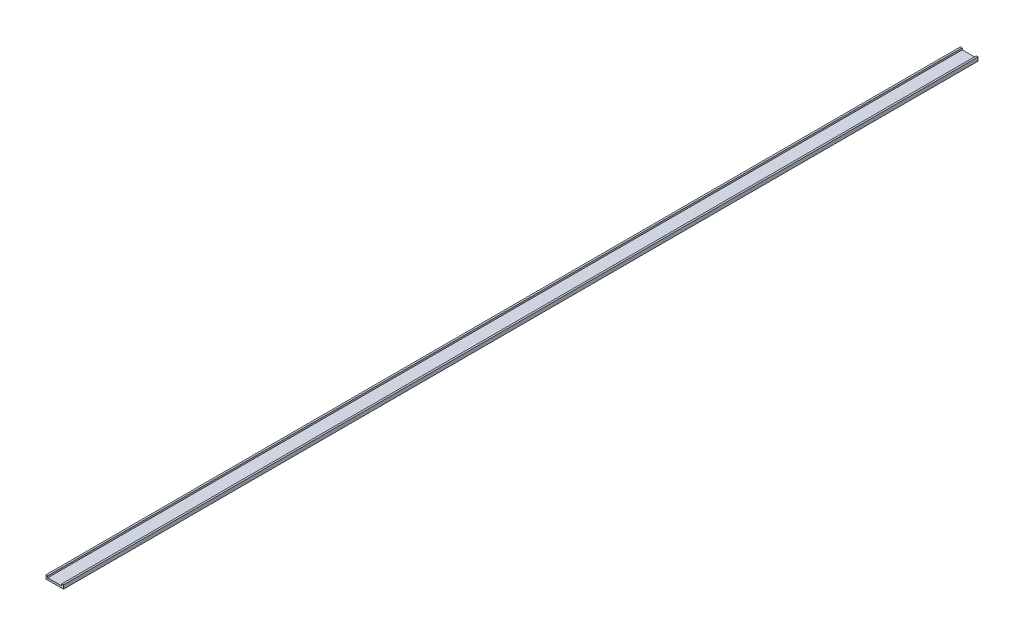
ISO-10303-21;
HEADER;
FILE_DESCRIPTION(('STEP AP214'),'2;1');
FILE_NAME('part.step','',(''),(''),'','','');
FILE_SCHEMA(('AUTOMOTIVE_DESIGN { 1 0 10303 214 1 1 1 1 }'));
ENDSEC;
DATA;
#1=APPLICATION_CONTEXT('core data for automotive mechanical design processes');
#2=APPLICATION_PROTOCOL_DEFINITION('international standard','automotive_design',2000,#1);
#3=PRODUCT_CONTEXT('',#1,'mechanical');
#4=PRODUCT('Part','Part','',(#3));
#5=PRODUCT_RELATED_PRODUCT_CATEGORY('part','',(#4));
#6=PRODUCT_DEFINITION_FORMATION('','',#4);
#7=PRODUCT_DEFINITION_CONTEXT('part definition',#1,'design');
#8=PRODUCT_DEFINITION('design','',#6,#7);
#9=PRODUCT_DEFINITION_SHAPE('','',#8);
#10=(LENGTH_UNIT() NAMED_UNIT(*) SI_UNIT(.MILLI.,.METRE.));
#11=(NAMED_UNIT(*) PLANE_ANGLE_UNIT() SI_UNIT($,.RADIAN.));
#12=(NAMED_UNIT(*) SI_UNIT($,.STERADIAN.) SOLID_ANGLE_UNIT());
#13=UNCERTAINTY_MEASURE_WITH_UNIT(LENGTH_MEASURE(1.E-05),#10,'distance_accuracy_value','');
#14=(GEOMETRIC_REPRESENTATION_CONTEXT(3) GLOBAL_UNCERTAINTY_ASSIGNED_CONTEXT((#13)) GLOBAL_UNIT_ASSIGNED_CONTEXT((#10,
#11,#12)) REPRESENTATION_CONTEXT('',''));
#15=CARTESIAN_POINT('',(0.,0.,0.));
#16=DIRECTION('',(0.,0.,1.));
#17=DIRECTION('',(1.,0.,0.));
#18=AXIS2_PLACEMENT_3D('',#15,#16,#17);
#19=CARTESIAN_POINT('',(-15.,0.,1570.));
#20=DIRECTION('',(1.,0.,0.));
#21=DIRECTION('',(0.,1.,0.));
#22=AXIS2_PLACEMENT_3D('',#19,#20,#21);
#23=PLANE('',#22);
#24=DIRECTION('',(0.,-1.,0.));
#25=VECTOR('',#24,1.);
#26=CARTESIAN_POINT('',(-15.,0.,0.));
#27=LINE('',#26,#25);
#28=CARTESIAN_POINT('',(-15.,6.5,0.));
#29=VERTEX_POINT('',#28);
#30=CARTESIAN_POINT('',(-15.,0.,0.));
#31=VERTEX_POINT('',#30);
#32=EDGE_CURVE('E131',#29,#31,#27,.T.);
#33=ORIENTED_EDGE('',*,*,#32,.T.);
#34=DIRECTION('',(0.,0.,-1.));
#35=VECTOR('',#34,1.);
#36=CARTESIAN_POINT('',(-15.,0.,1570.));
#37=LINE('',#36,#35);
#38=CARTESIAN_POINT('',(-15.,0.,1570.));
#39=VERTEX_POINT('',#38);
#40=EDGE_CURVE('E11',#39,#31,#37,.T.);
#41=ORIENTED_EDGE('',*,*,#40,.F.);
#42=DIRECTION('',(0.,-1.,0.));
#43=VECTOR('',#42,1.);
#44=CARTESIAN_POINT('',(-15.,0.,1570.));
#45=LINE('',#44,#43);
#46=CARTESIAN_POINT('',(-15.,6.5,1570.));
#47=VERTEX_POINT('',#46);
#48=EDGE_CURVE('E145',#47,#39,#45,.T.);
#49=ORIENTED_EDGE('',*,*,#48,.F.);
#50=DIRECTION('',(0.,0.,-1.));
#51=VECTOR('',#50,1.);
#52=CARTESIAN_POINT('',(-15.,6.5,1570.));
#53=LINE('',#52,#51);
#54=EDGE_CURVE('E127',#47,#29,#53,.T.);
#55=ORIENTED_EDGE('',*,*,#54,.T.);
#56=EDGE_LOOP('',(#33,#41,#49,#55));
#57=FACE_BOUND('',#56,.T.);
#58=ADVANCED_FACE('F35',(#57),#23,.F.);
#59=CARTESIAN_POINT('',(15.,0.,1570.));
#60=DIRECTION('',(0.,1.,0.));
#61=DIRECTION('',(-1.,0.,0.));
#62=AXIS2_PLACEMENT_3D('',#59,#60,#61);
#63=PLANE('',#62);
#64=DIRECTION('',(1.,0.,0.));
#65=VECTOR('',#64,1.);
#66=CARTESIAN_POINT('',(15.,0.,0.));
#67=LINE('',#66,#65);
#68=CARTESIAN_POINT('',(15.,0.,0.));
#69=VERTEX_POINT('',#68);
#70=EDGE_CURVE('E134',#31,#69,#67,.T.);
#71=ORIENTED_EDGE('',*,*,#70,.T.);
#72=DIRECTION('',(0.,0.,-1.));
#73=VECTOR('',#72,1.);
#74=CARTESIAN_POINT('',(15.,0.,1570.));
#75=LINE('',#74,#73);
#76=CARTESIAN_POINT('',(15.,0.,1570.));
#77=VERTEX_POINT('',#76);
#78=EDGE_CURVE('E43',#77,#69,#75,.T.);
#79=ORIENTED_EDGE('',*,*,#78,.F.);
#80=DIRECTION('',(1.,0.,0.));
#81=VECTOR('',#80,1.);
#82=CARTESIAN_POINT('',(15.,0.,1570.));
#83=LINE('',#82,#81);
#84=EDGE_CURVE('E94',#39,#77,#83,.T.);
#85=ORIENTED_EDGE('',*,*,#84,.F.);
#86=ORIENTED_EDGE('',*,*,#40,.T.);
#87=EDGE_LOOP('',(#71,#79,#85,#86));
#88=FACE_BOUND('',#87,.T.);
#89=ADVANCED_FACE('F180',(#88),#63,.F.);
#90=CARTESIAN_POINT('',(15.,0.,1570.));
#91=DIRECTION('',(-1.,0.,0.));
#92=DIRECTION('',(0.,-1.,0.));
#93=AXIS2_PLACEMENT_3D('',#90,#91,#92);
#94=PLANE('',#93);
#95=DIRECTION('',(0.,1.,0.));
#96=VECTOR('',#95,1.);
#97=CARTESIAN_POINT('',(15.,0.,0.));
#98=LINE('',#97,#96);
#99=CARTESIAN_POINT('',(15.,6.5,0.));
#100=VERTEX_POINT('',#99);
#101=EDGE_CURVE('E136',#69,#100,#98,.T.);
#102=ORIENTED_EDGE('',*,*,#101,.T.);
#103=DIRECTION('',(0.,0.,-1.));
#104=VECTOR('',#103,1.);
#105=CARTESIAN_POINT('',(15.,6.5,1570.));
#106=LINE('',#105,#104);
#107=CARTESIAN_POINT('',(15.,6.5,1570.));
#108=VERTEX_POINT('',#107);
#109=EDGE_CURVE('E152',#108,#100,#106,.T.);
#110=ORIENTED_EDGE('',*,*,#109,.F.);
#111=DIRECTION('',(0.,1.,0.));
#112=VECTOR('',#111,1.);
#113=CARTESIAN_POINT('',(15.,0.,1570.));
#114=LINE('',#113,#112);
#115=EDGE_CURVE('E160',#77,#108,#114,.T.);
#116=ORIENTED_EDGE('',*,*,#115,.F.);
#117=ORIENTED_EDGE('',*,*,#78,.T.);
#118=EDGE_LOOP('',(#102,#110,#116,#117));
#119=FACE_BOUND('',#118,.T.);
#120=ADVANCED_FACE('F158',(#119),#94,.F.);
#121=CARTESIAN_POINT('',(15.,6.5,1570.));
#122=DIRECTION('',(0.,-1.,0.));
#123=DIRECTION('',(0.,0.,-1.));
#124=AXIS2_PLACEMENT_3D('',#121,#122,#123);
#125=PLANE('',#124);
#126=DIRECTION('',(-1.,0.,0.));
#127=VECTOR('',#126,1.);
#128=CARTESIAN_POINT('',(15.,6.5,0.));
#129=LINE('',#128,#127);
#130=CARTESIAN_POINT('',(12.,6.5,0.));
#131=VERTEX_POINT('',#130);
#132=EDGE_CURVE('E138',#100,#131,#129,.T.);
#133=ORIENTED_EDGE('',*,*,#132,.T.);
#134=DIRECTION('',(0.,0.,-1.));
#135=VECTOR('',#134,1.);
#136=CARTESIAN_POINT('',(12.,6.5,1570.));
#137=LINE('',#136,#135);
#138=CARTESIAN_POINT('',(12.,6.5,1570.));
#139=VERTEX_POINT('',#138);
#140=EDGE_CURVE('E149',#139,#131,#137,.T.);
#141=ORIENTED_EDGE('',*,*,#140,.F.);
#142=DIRECTION('',(-1.,0.,0.));
#143=VECTOR('',#142,1.);
#144=CARTESIAN_POINT('',(15.,6.5,1570.));
#145=LINE('',#144,#143);
#146=EDGE_CURVE('E172',#108,#139,#145,.T.);
#147=ORIENTED_EDGE('',*,*,#146,.F.);
#148=ORIENTED_EDGE('',*,*,#109,.T.);
#149=EDGE_LOOP('',(#133,#141,#147,#148));
#150=FACE_BOUND('',#149,.T.);
#151=ADVANCED_FACE('F168',(#150),#125,.F.);
#152=CARTESIAN_POINT('',(12.,6.5,1570.));
#153=DIRECTION('',(1.,0.,0.));
#154=DIRECTION('',(0.,0.,-1.));
#155=AXIS2_PLACEMENT_3D('',#152,#153,#154);
#156=PLANE('',#155);
#157=DIRECTION('',(0.,-1.,0.));
#158=VECTOR('',#157,1.);
#159=CARTESIAN_POINT('',(12.,6.5,0.));
#160=LINE('',#159,#158);
#161=CARTESIAN_POINT('',(12.,3.5,0.));
#162=VERTEX_POINT('',#161);
#163=EDGE_CURVE('E140',#131,#162,#160,.T.);
#164=ORIENTED_EDGE('',*,*,#163,.T.);
#165=DIRECTION('',(0.,0.,-1.));
#166=VECTOR('',#165,1.);
#167=CARTESIAN_POINT('',(12.,3.5,1570.));
#168=LINE('',#167,#166);
#169=CARTESIAN_POINT('',(12.,3.5,1570.));
#170=VERTEX_POINT('',#169);
#171=EDGE_CURVE('E122',#170,#162,#168,.T.);
#172=ORIENTED_EDGE('',*,*,#171,.F.);
#173=DIRECTION('',(0.,-1.,0.));
#174=VECTOR('',#173,1.);
#175=CARTESIAN_POINT('',(12.,6.5,1570.));
#176=LINE('',#175,#174);
#177=EDGE_CURVE('E113',#139,#170,#176,.T.);
#178=ORIENTED_EDGE('',*,*,#177,.F.);
#179=ORIENTED_EDGE('',*,*,#140,.T.);
#180=EDGE_LOOP('',(#164,#172,#178,#179));
#181=FACE_BOUND('',#180,.T.);
#182=ADVANCED_FACE('F171',(#181),#156,.F.);
#183=CARTESIAN_POINT('',(-12.,3.5,1570.));
#184=DIRECTION('',(0.,-1.,0.));
#185=DIRECTION('',(1.,0.,0.));
#186=AXIS2_PLACEMENT_3D('',#183,#184,#185);
#187=PLANE('',#186);
#188=DIRECTION('',(-1.,0.,0.));
#189=VECTOR('',#188,1.);
#190=CARTESIAN_POINT('',(-12.,3.5,0.));
#191=LINE('',#190,#189);
#192=CARTESIAN_POINT('',(-12.,3.5,0.));
#193=VERTEX_POINT('',#192);
#194=EDGE_CURVE('E121',#162,#193,#191,.T.);
#195=ORIENTED_EDGE('',*,*,#194,.T.);
#196=DIRECTION('',(0.,0.,-1.));
#197=VECTOR('',#196,1.);
#198=CARTESIAN_POINT('',(-12.,3.5,1570.));
#199=LINE('',#198,#197);
#200=CARTESIAN_POINT('',(-12.,3.5,1570.));
#201=VERTEX_POINT('',#200);
#202=EDGE_CURVE('E118',#201,#193,#199,.T.);
#203=ORIENTED_EDGE('',*,*,#202,.F.);
#204=DIRECTION('',(-1.,0.,0.));
#205=VECTOR('',#204,1.);
#206=CARTESIAN_POINT('',(-12.,3.5,1570.));
#207=LINE('',#206,#205);
#208=EDGE_CURVE('E107',#170,#201,#207,.T.);
#209=ORIENTED_EDGE('',*,*,#208,.F.);
#210=ORIENTED_EDGE('',*,*,#171,.T.);
#211=EDGE_LOOP('',(#195,#203,#209,#210));
#212=FACE_BOUND('',#211,.T.);
#213=ADVANCED_FACE('F119',(#212),#187,.F.);
#214=CARTESIAN_POINT('',(-12.,6.5,1570.));
#215=DIRECTION('',(-1.,0.,0.));
#216=DIRECTION('',(0.,0.,1.));
#217=AXIS2_PLACEMENT_3D('',#214,#215,#216);
#218=PLANE('',#217);
#219=DIRECTION('',(0.,1.,0.));
#220=VECTOR('',#219,1.);
#221=CARTESIAN_POINT('',(-12.,6.5,0.));
#222=LINE('',#221,#220);
#223=CARTESIAN_POINT('',(-12.,6.5,0.));
#224=VERTEX_POINT('',#223);
#225=EDGE_CURVE('E80',#193,#224,#222,.T.);
#226=ORIENTED_EDGE('',*,*,#225,.T.);
#227=DIRECTION('',(0.,0.,-1.));
#228=VECTOR('',#227,1.);
#229=CARTESIAN_POINT('',(-12.,6.5,1570.));
#230=LINE('',#229,#228);
#231=CARTESIAN_POINT('',(-12.,6.5,1570.));
#232=VERTEX_POINT('',#231);
#233=EDGE_CURVE('E123',#232,#224,#230,.T.);
#234=ORIENTED_EDGE('',*,*,#233,.F.);
#235=DIRECTION('',(0.,1.,0.));
#236=VECTOR('',#235,1.);
#237=CARTESIAN_POINT('',(-12.,6.5,1570.));
#238=LINE('',#237,#236);
#239=EDGE_CURVE('E111',#201,#232,#238,.T.);
#240=ORIENTED_EDGE('',*,*,#239,.F.);
#241=ORIENTED_EDGE('',*,*,#202,.T.);
#242=EDGE_LOOP('',(#226,#234,#240,#241));
#243=FACE_BOUND('',#242,.T.);
#244=ADVANCED_FACE('F125',(#243),#218,.F.);
#245=CARTESIAN_POINT('',(-15.,6.5,1570.));
#246=DIRECTION('',(0.,-1.,0.));
#247=DIRECTION('',(1.,0.,0.));
#248=AXIS2_PLACEMENT_3D('',#245,#246,#247);
#249=PLANE('',#248);
#250=DIRECTION('',(-1.,0.,0.));
#251=VECTOR('',#250,1.);
#252=CARTESIAN_POINT('',(-15.,6.5,0.));
#253=LINE('',#252,#251);
#254=EDGE_CURVE('E86',#224,#29,#253,.T.);
#255=ORIENTED_EDGE('',*,*,#254,.T.);
#256=ORIENTED_EDGE('',*,*,#54,.F.);
#257=DIRECTION('',(-1.,0.,0.));
#258=VECTOR('',#257,1.);
#259=CARTESIAN_POINT('',(-15.,6.5,1570.));
#260=LINE('',#259,#258);
#261=EDGE_CURVE('E51',#232,#47,#260,.T.);
#262=ORIENTED_EDGE('',*,*,#261,.F.);
#263=ORIENTED_EDGE('',*,*,#233,.T.);
#264=EDGE_LOOP('',(#255,#256,#262,#263));
#265=FACE_BOUND('',#264,.T.);
#266=ADVANCED_FACE('F196',(#265),#249,.F.);
#267=CARTESIAN_POINT('',(0.,0.,1570.));
#268=DIRECTION('',(0.,0.,-1.));
#269=DIRECTION('',(-1.,0.,0.));
#270=AXIS2_PLACEMENT_3D('',#267,#268,#269);
#271=PLANE('',#270);
#272=ORIENTED_EDGE('',*,*,#48,.T.);
#273=ORIENTED_EDGE('',*,*,#84,.T.);
#274=ORIENTED_EDGE('',*,*,#115,.T.);
#275=ORIENTED_EDGE('',*,*,#146,.T.);
#276=ORIENTED_EDGE('',*,*,#177,.T.);
#277=ORIENTED_EDGE('',*,*,#208,.T.);
#278=ORIENTED_EDGE('',*,*,#239,.T.);
#279=ORIENTED_EDGE('',*,*,#261,.T.);
#280=EDGE_LOOP('',(#272,#273,#274,#275,#276,#277,#278,#279));
#281=FACE_BOUND('',#280,.T.);
#282=ADVANCED_FACE('F109',(#281),#271,.F.);
#283=CARTESIAN_POINT('',(0.,0.,0.));
#284=DIRECTION('',(0.,0.,-1.));
#285=DIRECTION('',(-1.,0.,0.));
#286=AXIS2_PLACEMENT_3D('',#283,#284,#285);
#287=PLANE('',#286);
#288=ORIENTED_EDGE('',*,*,#32,.F.);
#289=ORIENTED_EDGE('',*,*,#254,.F.);
#290=ORIENTED_EDGE('',*,*,#225,.F.);
#291=ORIENTED_EDGE('',*,*,#194,.F.);
#292=ORIENTED_EDGE('',*,*,#163,.F.);
#293=ORIENTED_EDGE('',*,*,#132,.F.);
#294=ORIENTED_EDGE('',*,*,#101,.F.);
#295=ORIENTED_EDGE('',*,*,#70,.F.);
#296=EDGE_LOOP('',(#288,#289,#290,#291,#292,#293,#294,#295));
#297=FACE_BOUND('',#296,.T.);
#298=ADVANCED_FACE('F164',(#297),#287,.T.);
#299=CLOSED_SHELL('',(#58,#89,#120,#151,#182,#213,#244,#266,#282,#298));
#300=MANIFOLD_SOLID_BREP('B2',#299);
#301=ADVANCED_BREP_SHAPE_REPRESENTATION('',(#18,#300),#14);
#302=SHAPE_DEFINITION_REPRESENTATION(#9,#301);
ENDSEC;
END-ISO-10303-21;
